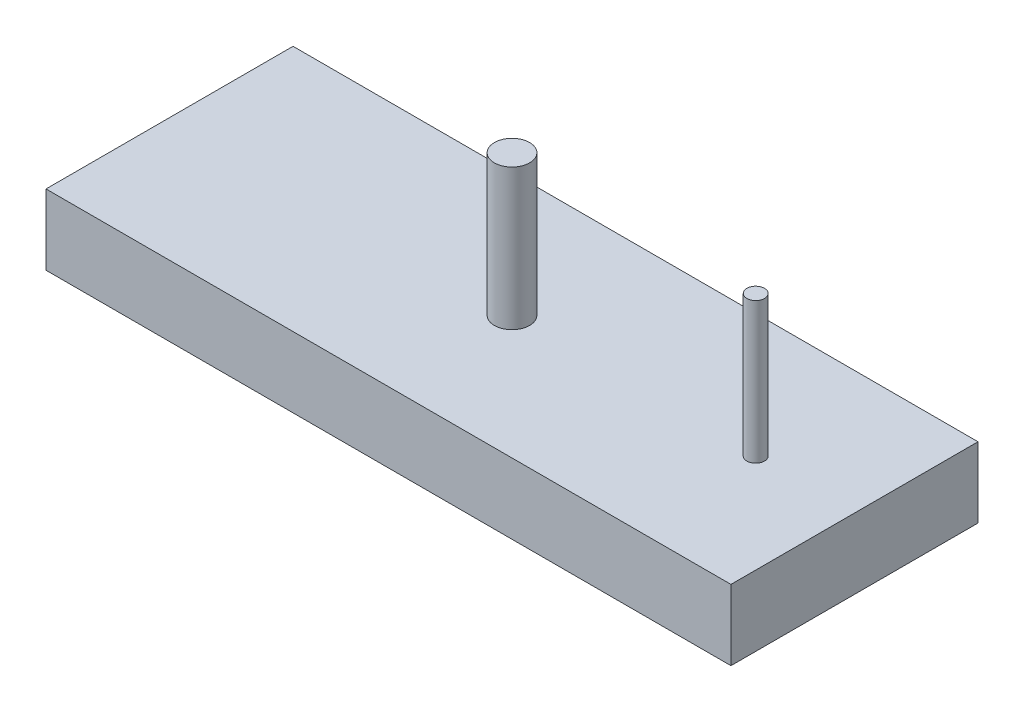
ISO-10303-21;
HEADER;
FILE_DESCRIPTION(('STEP AP214'),'2;1');
FILE_NAME('part.step','',(''),(''),'','','');
FILE_SCHEMA(('AUTOMOTIVE_DESIGN { 1 0 10303 214 1 1 1 1 }'));
ENDSEC;
DATA;
#1=APPLICATION_CONTEXT('core data for automotive mechanical design processes');
#2=APPLICATION_PROTOCOL_DEFINITION('international standard','automotive_design',2000,#1);
#3=PRODUCT_CONTEXT('',#1,'mechanical');
#4=PRODUCT('Part','Part','',(#3));
#5=PRODUCT_RELATED_PRODUCT_CATEGORY('part','',(#4));
#6=PRODUCT_DEFINITION_FORMATION('','',#4);
#7=PRODUCT_DEFINITION_CONTEXT('part definition',#1,'design');
#8=PRODUCT_DEFINITION('design','',#6,#7);
#9=PRODUCT_DEFINITION_SHAPE('','',#8);
#10=(LENGTH_UNIT() NAMED_UNIT(*) SI_UNIT(.MILLI.,.METRE.));
#11=(NAMED_UNIT(*) PLANE_ANGLE_UNIT() SI_UNIT($,.RADIAN.));
#12=(NAMED_UNIT(*) SI_UNIT($,.STERADIAN.) SOLID_ANGLE_UNIT());
#13=UNCERTAINTY_MEASURE_WITH_UNIT(LENGTH_MEASURE(1.E-05),#10,'distance_accuracy_value','');
#14=(GEOMETRIC_REPRESENTATION_CONTEXT(3) GLOBAL_UNCERTAINTY_ASSIGNED_CONTEXT((#13)) GLOBAL_UNIT_ASSIGNED_CONTEXT((#10,
#11,#12)) REPRESENTATION_CONTEXT('',''));
#15=CARTESIAN_POINT('',(0.,0.,0.));
#16=DIRECTION('',(0.,0.,1.));
#17=DIRECTION('',(1.,0.,0.));
#18=AXIS2_PLACEMENT_3D('',#15,#16,#17);
#19=CARTESIAN_POINT('',(48.6271200962278,10.,-17.5391504302111));
#20=DIRECTION('',(-1.,0.,0.));
#21=DIRECTION('',(0.,0.,1.));
#22=AXIS2_PLACEMENT_3D('',#19,#20,#21);
#23=PLANE('',#22);
#24=DIRECTION('',(0.,0.,-1.));
#25=VECTOR('',#24,1.);
#26=CARTESIAN_POINT('',(48.6271200962278,0.,-17.5391504302111));
#27=LINE('',#26,#25);
#28=CARTESIAN_POINT('',(48.6271200962278,0.,17.5391504302111));
#29=VERTEX_POINT('',#28);
#30=CARTESIAN_POINT('',(48.6271200962278,0.,-17.5391504302111));
#31=VERTEX_POINT('',#30);
#32=EDGE_CURVE('E109',#29,#31,#27,.T.);
#33=ORIENTED_EDGE('',*,*,#32,.T.);
#34=DIRECTION('',(0.,-1.,0.));
#35=VECTOR('',#34,1.);
#36=CARTESIAN_POINT('',(48.6271200962278,10.,-17.5391504302111));
#37=LINE('',#36,#35);
#38=CARTESIAN_POINT('',(48.6271200962278,10.,-17.5391504302111));
#39=VERTEX_POINT('',#38);
#40=EDGE_CURVE('E11',#39,#31,#37,.T.);
#41=ORIENTED_EDGE('',*,*,#40,.F.);
#42=DIRECTION('',(0.,0.,-1.));
#43=VECTOR('',#42,1.);
#44=CARTESIAN_POINT('',(48.6271200962278,10.,-17.5391504302111));
#45=LINE('',#44,#43);
#46=CARTESIAN_POINT('',(48.6271200962278,10.,17.5391504302111));
#47=VERTEX_POINT('',#46);
#48=EDGE_CURVE('E93',#47,#39,#45,.T.);
#49=ORIENTED_EDGE('',*,*,#48,.F.);
#50=DIRECTION('',(0.,-1.,0.));
#51=VECTOR('',#50,1.);
#52=CARTESIAN_POINT('',(48.6271200962278,10.,17.5391504302111));
#53=LINE('',#52,#51);
#54=EDGE_CURVE('E105',#47,#29,#53,.T.);
#55=ORIENTED_EDGE('',*,*,#54,.T.);
#56=EDGE_LOOP('',(#33,#41,#49,#55));
#57=FACE_BOUND('',#56,.T.);
#58=ADVANCED_FACE('F41',(#57),#23,.F.);
#59=CARTESIAN_POINT('',(-48.6271200962278,10.,-17.5391504302111));
#60=DIRECTION('',(0.,0.,1.));
#61=DIRECTION('',(1.,0.,0.));
#62=AXIS2_PLACEMENT_3D('',#59,#60,#61);
#63=PLANE('',#62);
#64=DIRECTION('',(-1.,0.,0.));
#65=VECTOR('',#64,1.);
#66=CARTESIAN_POINT('',(-48.6271200962278,0.,-17.5391504302111));
#67=LINE('',#66,#65);
#68=CARTESIAN_POINT('',(-48.6271200962278,0.,-17.5391504302111));
#69=VERTEX_POINT('',#68);
#70=EDGE_CURVE('E98',#31,#69,#67,.T.);
#71=ORIENTED_EDGE('',*,*,#70,.T.);
#72=DIRECTION('',(0.,-1.,0.));
#73=VECTOR('',#72,1.);
#74=CARTESIAN_POINT('',(-48.6271200962278,10.,-17.5391504302111));
#75=LINE('',#74,#73);
#76=CARTESIAN_POINT('',(-48.6271200962278,10.,-17.5391504302111));
#77=VERTEX_POINT('',#76);
#78=EDGE_CURVE('E50',#77,#69,#75,.T.);
#79=ORIENTED_EDGE('',*,*,#78,.F.);
#80=DIRECTION('',(-1.,0.,0.));
#81=VECTOR('',#80,1.);
#82=CARTESIAN_POINT('',(-48.6271200962278,10.,-17.5391504302111));
#83=LINE('',#82,#81);
#84=EDGE_CURVE('E88',#39,#77,#83,.T.);
#85=ORIENTED_EDGE('',*,*,#84,.F.);
#86=ORIENTED_EDGE('',*,*,#40,.T.);
#87=EDGE_LOOP('',(#71,#79,#85,#86));
#88=FACE_BOUND('',#87,.T.);
#89=ADVANCED_FACE('F97',(#88),#63,.F.);
#90=CARTESIAN_POINT('',(-48.6271200962278,10.,-17.5391504302111));
#91=DIRECTION('',(1.,0.,0.));
#92=DIRECTION('',(0.,0.,-1.));
#93=AXIS2_PLACEMENT_3D('',#90,#91,#92);
#94=PLANE('',#93);
#95=DIRECTION('',(0.,0.,1.));
#96=VECTOR('',#95,1.);
#97=CARTESIAN_POINT('',(-48.6271200962278,0.,-17.5391504302111));
#98=LINE('',#97,#96);
#99=CARTESIAN_POINT('',(-48.6271200962278,0.,17.5391504302111));
#100=VERTEX_POINT('',#99);
#101=EDGE_CURVE('E75',#69,#100,#98,.T.);
#102=ORIENTED_EDGE('',*,*,#101,.T.);
#103=DIRECTION('',(0.,-1.,0.));
#104=VECTOR('',#103,1.);
#105=CARTESIAN_POINT('',(-48.6271200962278,10.,17.5391504302111));
#106=LINE('',#105,#104);
#107=CARTESIAN_POINT('',(-48.6271200962278,10.,17.5391504302111));
#108=VERTEX_POINT('',#107);
#109=EDGE_CURVE('E100',#108,#100,#106,.T.);
#110=ORIENTED_EDGE('',*,*,#109,.F.);
#111=DIRECTION('',(0.,0.,1.));
#112=VECTOR('',#111,1.);
#113=CARTESIAN_POINT('',(-48.6271200962278,10.,-17.5391504302111));
#114=LINE('',#113,#112);
#115=EDGE_CURVE('E91',#77,#108,#114,.T.);
#116=ORIENTED_EDGE('',*,*,#115,.F.);
#117=ORIENTED_EDGE('',*,*,#78,.T.);
#118=EDGE_LOOP('',(#102,#110,#116,#117));
#119=FACE_BOUND('',#118,.T.);
#120=ADVANCED_FACE('F101',(#119),#94,.F.);
#121=CARTESIAN_POINT('',(-48.6271200962278,10.,17.5391504302111));
#122=DIRECTION('',(0.,0.,-1.));
#123=DIRECTION('',(-1.,0.,0.));
#124=AXIS2_PLACEMENT_3D('',#121,#122,#123);
#125=PLANE('',#124);
#126=DIRECTION('',(1.,0.,0.));
#127=VECTOR('',#126,1.);
#128=CARTESIAN_POINT('',(-48.6271200962278,0.,17.5391504302111));
#129=LINE('',#128,#127);
#130=EDGE_CURVE('E81',#100,#29,#129,.T.);
#131=ORIENTED_EDGE('',*,*,#130,.T.);
#132=ORIENTED_EDGE('',*,*,#54,.F.);
#133=DIRECTION('',(1.,0.,0.));
#134=VECTOR('',#133,1.);
#135=CARTESIAN_POINT('',(-48.6271200962278,10.,17.5391504302111));
#136=LINE('',#135,#134);
#137=EDGE_CURVE('E58',#108,#47,#136,.T.);
#138=ORIENTED_EDGE('',*,*,#137,.F.);
#139=ORIENTED_EDGE('',*,*,#109,.T.);
#140=EDGE_LOOP('',(#131,#132,#138,#139));
#141=FACE_BOUND('',#140,.T.);
#142=ADVANCED_FACE('F123',(#141),#125,.F.);
#143=CARTESIAN_POINT('',(0.,10.,0.));
#144=DIRECTION('',(0.,1.,0.));
#145=DIRECTION('',(0.,0.,1.));
#146=AXIS2_PLACEMENT_3D('',#143,#144,#145);
#147=PLANE('',#146);
#148=CARTESIAN_POINT('',(34.6,10.,0.));
#149=DIRECTION('',(0.,1.,0.));
#150=DIRECTION('',(0.,0.,1.));
#151=AXIS2_PLACEMENT_3D('',#148,#149,#150);
#152=CIRCLE('',#151,1.25);
#153=CARTESIAN_POINT('',(34.6,10.,1.25));
#154=VERTEX_POINT('',#153);
#155=EDGE_CURVE('E138',#154,#154,#152,.T.);
#156=ORIENTED_EDGE('',*,*,#155,.F.);
#157=EDGE_LOOP('',(#156));
#158=FACE_BOUND('',#157,.T.);
#159=CARTESIAN_POINT('',(0.,10.,0.));
#160=DIRECTION('',(0.,1.,0.));
#161=DIRECTION('',(0.,0.,1.));
#162=AXIS2_PLACEMENT_3D('',#159,#160,#161);
#163=CIRCLE('',#162,2.5);
#164=CARTESIAN_POINT('',(0.,10.,2.5));
#165=VERTEX_POINT('',#164);
#166=EDGE_CURVE('E130',#165,#165,#163,.T.);
#167=ORIENTED_EDGE('',*,*,#166,.F.);
#168=EDGE_LOOP('',(#167));
#169=FACE_BOUND('',#168,.T.);
#170=ORIENTED_EDGE('',*,*,#48,.T.);
#171=ORIENTED_EDGE('',*,*,#84,.T.);
#172=ORIENTED_EDGE('',*,*,#115,.T.);
#173=ORIENTED_EDGE('',*,*,#137,.T.);
#174=EDGE_LOOP('',(#170,#171,#172,#173));
#175=FACE_BOUND('',#174,.T.);
#176=ADVANCED_FACE('F89',(#158,#169,#175),#147,.T.);
#177=CARTESIAN_POINT('',(0.,0.,0.));
#178=DIRECTION('',(0.,1.,0.));
#179=DIRECTION('',(0.,0.,1.));
#180=AXIS2_PLACEMENT_3D('',#177,#178,#179);
#181=PLANE('',#180);
#182=ORIENTED_EDGE('',*,*,#32,.F.);
#183=ORIENTED_EDGE('',*,*,#130,.F.);
#184=ORIENTED_EDGE('',*,*,#101,.F.);
#185=ORIENTED_EDGE('',*,*,#70,.F.);
#186=EDGE_LOOP('',(#182,#183,#184,#185));
#187=FACE_BOUND('',#186,.T.);
#188=ADVANCED_FACE('F126',(#187),#181,.F.);
#189=CARTESIAN_POINT('',(0.,30.,0.));
#190=DIRECTION('',(0.,-1.,0.));
#191=DIRECTION('',(0.,0.,-1.));
#192=AXIS2_PLACEMENT_3D('',#189,#190,#191);
#193=CYLINDRICAL_SURFACE('',#192,2.5);
#194=CARTESIAN_POINT('',(0.,30.,0.));
#195=DIRECTION('',(0.,1.,0.));
#196=DIRECTION('',(0.,0.,1.));
#197=AXIS2_PLACEMENT_3D('',#194,#195,#196);
#198=CIRCLE('',#197,2.5);
#199=CARTESIAN_POINT('',(0.,30.,2.5));
#200=VERTEX_POINT('',#199);
#201=EDGE_CURVE('E113',#200,#200,#198,.T.);
#202=ORIENTED_EDGE('',*,*,#201,.F.);
#203=EDGE_LOOP('',(#202));
#204=FACE_BOUND('',#203,.T.);
#205=ORIENTED_EDGE('',*,*,#166,.T.);
#206=EDGE_LOOP('',(#205));
#207=FACE_BOUND('',#206,.T.);
#208=ADVANCED_FACE('F160',(#204,#207),#193,.T.);
#209=CARTESIAN_POINT('',(0.,30.,0.));
#210=DIRECTION('',(0.,1.,0.));
#211=DIRECTION('',(0.,0.,1.));
#212=AXIS2_PLACEMENT_3D('',#209,#210,#211);
#213=PLANE('',#212);
#214=ORIENTED_EDGE('',*,*,#201,.T.);
#215=EDGE_LOOP('',(#214));
#216=FACE_BOUND('',#215,.T.);
#217=ADVANCED_FACE('F151',(#216),#213,.T.);
#218=CARTESIAN_POINT('',(34.6,30.,0.));
#219=DIRECTION('',(0.,-1.,0.));
#220=DIRECTION('',(0.,0.,-1.));
#221=AXIS2_PLACEMENT_3D('',#218,#219,#220);
#222=CYLINDRICAL_SURFACE('',#221,1.25);
#223=CARTESIAN_POINT('',(34.6,30.,0.));
#224=DIRECTION('',(0.,1.,0.));
#225=DIRECTION('',(0.,0.,1.));
#226=AXIS2_PLACEMENT_3D('',#223,#224,#225);
#227=CIRCLE('',#226,1.25);
#228=CARTESIAN_POINT('',(34.6,30.,1.25));
#229=VERTEX_POINT('',#228);
#230=EDGE_CURVE('E134',#229,#229,#227,.T.);
#231=ORIENTED_EDGE('',*,*,#230,.F.);
#232=EDGE_LOOP('',(#231));
#233=FACE_BOUND('',#232,.T.);
#234=ORIENTED_EDGE('',*,*,#155,.T.);
#235=EDGE_LOOP('',(#234));
#236=FACE_BOUND('',#235,.T.);
#237=ADVANCED_FACE('F148',(#233,#236),#222,.T.);
#238=CARTESIAN_POINT('',(34.6,30.,0.));
#239=DIRECTION('',(0.,1.,0.));
#240=DIRECTION('',(0.,0.,1.));
#241=AXIS2_PLACEMENT_3D('',#238,#239,#240);
#242=PLANE('',#241);
#243=ORIENTED_EDGE('',*,*,#230,.T.);
#244=EDGE_LOOP('',(#243));
#245=FACE_BOUND('',#244,.T.);
#246=ADVANCED_FACE('F146',(#245),#242,.T.);
#247=CLOSED_SHELL('',(#58,#89,#120,#142,#176,#188,#208,#217,#237,#246));
#248=MANIFOLD_SOLID_BREP('B2',#247);
#249=ADVANCED_BREP_SHAPE_REPRESENTATION('',(#18,#248),#14);
#250=SHAPE_DEFINITION_REPRESENTATION(#9,#249);
ENDSEC;
END-ISO-10303-21;
